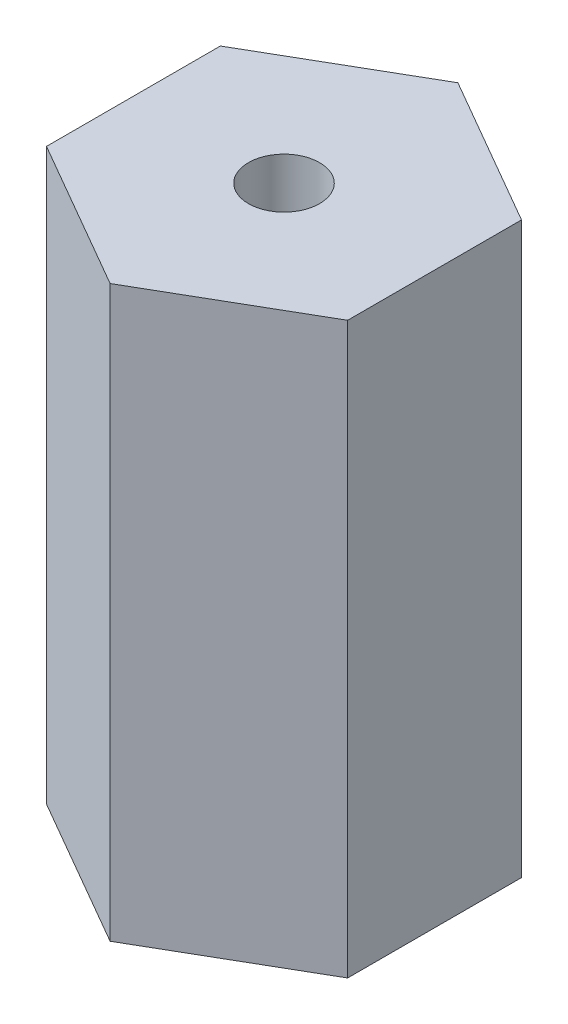
ISO-10303-21;
HEADER;
FILE_DESCRIPTION(('STEP AP214'),'2;1');
FILE_NAME('part.step','',(''),(''),'','','');
FILE_SCHEMA(('AUTOMOTIVE_DESIGN { 1 0 10303 214 1 1 1 1 }'));
ENDSEC;
DATA;
#1=APPLICATION_CONTEXT('core data for automotive mechanical design processes');
#2=APPLICATION_PROTOCOL_DEFINITION('international standard','automotive_design',2000,#1);
#3=PRODUCT_CONTEXT('',#1,'mechanical');
#4=PRODUCT('Part','Part','',(#3));
#5=PRODUCT_RELATED_PRODUCT_CATEGORY('part','',(#4));
#6=PRODUCT_DEFINITION_FORMATION('','',#4);
#7=PRODUCT_DEFINITION_CONTEXT('part definition',#1,'design');
#8=PRODUCT_DEFINITION('design','',#6,#7);
#9=PRODUCT_DEFINITION_SHAPE('','',#8);
#10=(LENGTH_UNIT() NAMED_UNIT(*) SI_UNIT(.MILLI.,.METRE.));
#11=(NAMED_UNIT(*) PLANE_ANGLE_UNIT() SI_UNIT($,.RADIAN.));
#12=(NAMED_UNIT(*) SI_UNIT($,.STERADIAN.) SOLID_ANGLE_UNIT());
#13=UNCERTAINTY_MEASURE_WITH_UNIT(LENGTH_MEASURE(1.E-05),#10,'distance_accuracy_value','');
#14=(GEOMETRIC_REPRESENTATION_CONTEXT(3) GLOBAL_UNCERTAINTY_ASSIGNED_CONTEXT((#13)) GLOBAL_UNIT_ASSIGNED_CONTEXT((#10,
#11,#12)) REPRESENTATION_CONTEXT('',''));
#15=CARTESIAN_POINT('',(0.,0.,0.));
#16=DIRECTION('',(0.,0.,1.));
#17=DIRECTION('',(1.,0.,0.));
#18=AXIS2_PLACEMENT_3D('',#15,#16,#17);
#19=CARTESIAN_POINT('',(0.,24.0204498,0.));
#20=DIRECTION('',(0.,1.,0.));
#21=DIRECTION('',(0.,0.,1.));
#22=AXIS2_PLACEMENT_3D('',#19,#20,#21);
#23=PLANE('',#22);
#24=DIRECTION('',(-0.866025403784442,0.,-0.499999999999995));
#25=VECTOR('',#24,1.);
#26=CARTESIAN_POINT('',(6.34999999999996,24.0204498,-3.6661742093542));
#27=LINE('',#26,#25);
#28=CARTESIAN_POINT('',(6.34999999999996,24.0204498,-3.6661742093542));
#29=VERTEX_POINT('',#28);
#30=CARTESIAN_POINT('',(0.,24.0204498,-7.33234841870825));
#31=VERTEX_POINT('',#30);
#32=EDGE_CURVE('E136',#29,#31,#27,.T.);
#33=ORIENTED_EDGE('',*,*,#32,.T.);
#34=DIRECTION('',(-0.866025403784438,0.,0.500000000000001));
#35=VECTOR('',#34,1.);
#36=CARTESIAN_POINT('',(0.,24.0204498,-7.33234841870825));
#37=LINE('',#36,#35);
#38=CARTESIAN_POINT('',(-6.35000000000001,24.0204498,-3.66617420935411));
#39=VERTEX_POINT('',#38);
#40=EDGE_CURVE('E94',#31,#39,#37,.T.);
#41=ORIENTED_EDGE('',*,*,#40,.T.);
#42=DIRECTION('',(0.,0.,1.));
#43=VECTOR('',#42,1.);
#44=CARTESIAN_POINT('',(-6.35000000000001,24.0204498,-3.66617420935411));
#45=LINE('',#44,#43);
#46=CARTESIAN_POINT('',(-6.34999999999999,24.0204498,3.66617420935416));
#47=VERTEX_POINT('',#46);
#48=EDGE_CURVE('E107',#39,#47,#45,.T.);
#49=ORIENTED_EDGE('',*,*,#48,.T.);
#50=DIRECTION('',(0.866025403784442,0.,0.499999999999995));
#51=VECTOR('',#50,1.);
#52=CARTESIAN_POINT('',(-6.34999999999999,24.0204498,3.66617420935416));
#53=LINE('',#52,#51);
#54=CARTESIAN_POINT('',(0.,24.0204498,7.33234841870825));
#55=VERTEX_POINT('',#54);
#56=EDGE_CURVE('E101',#47,#55,#53,.T.);
#57=ORIENTED_EDGE('',*,*,#56,.T.);
#58=DIRECTION('',(0.866025403784435,0.,-0.500000000000007));
#59=VECTOR('',#58,1.);
#60=CARTESIAN_POINT('',(0.,24.0204498,7.33234841870825));
#61=LINE('',#60,#59);
#62=CARTESIAN_POINT('',(6.35000000000004,24.0204498,3.66617420935407));
#63=VERTEX_POINT('',#62);
#64=EDGE_CURVE('E105',#55,#63,#61,.T.);
#65=ORIENTED_EDGE('',*,*,#64,.T.);
#66=DIRECTION('',(0.,0.,-1.));
#67=VECTOR('',#66,1.);
#68=CARTESIAN_POINT('',(6.35000000000004,24.0204498,3.66617420935407));
#69=LINE('',#68,#67);
#70=EDGE_CURVE('E57',#63,#29,#69,.T.);
#71=ORIENTED_EDGE('',*,*,#70,.T.);
#72=EDGE_LOOP('',(#33,#41,#49,#57,#65,#71));
#73=FACE_BOUND('',#72,.T.);
#74=CARTESIAN_POINT('',(0.,24.0204498,0.));
#75=DIRECTION('',(0.,1.,0.));
#76=DIRECTION('',(0.,0.,1.));
#77=AXIS2_PLACEMENT_3D('',#74,#75,#76);
#78=CIRCLE('',#77,1.5);
#79=CARTESIAN_POINT('',(0.,24.0204498,1.5));
#80=VERTEX_POINT('',#79);
#81=EDGE_CURVE('E129',#80,#80,#78,.T.);
#82=ORIENTED_EDGE('',*,*,#81,.F.);
#83=EDGE_LOOP('',(#82));
#84=FACE_BOUND('',#83,.T.);
#85=ADVANCED_FACE('F39',(#73,#84),#23,.T.);
#86=CARTESIAN_POINT('',(0.,0.,0.));
#87=DIRECTION('',(0.,1.,0.));
#88=DIRECTION('',(0.,0.,1.));
#89=AXIS2_PLACEMENT_3D('',#86,#87,#88);
#90=PLANE('',#89);
#91=CARTESIAN_POINT('',(0.,0.,0.));
#92=DIRECTION('',(0.,1.,0.));
#93=DIRECTION('',(0.,0.,1.));
#94=AXIS2_PLACEMENT_3D('',#91,#92,#93);
#95=CIRCLE('',#94,5.);
#96=CARTESIAN_POINT('',(0.,0.,5.));
#97=VERTEX_POINT('',#96);
#98=EDGE_CURVE('E185',#97,#97,#95,.T.);
#99=ORIENTED_EDGE('',*,*,#98,.T.);
#100=EDGE_LOOP('',(#99));
#101=FACE_BOUND('',#100,.T.);
#102=DIRECTION('',(-0.866025403784442,0.,-0.499999999999995));
#103=VECTOR('',#102,1.);
#104=CARTESIAN_POINT('',(6.34999999999996,0.,-3.6661742093542));
#105=LINE('',#104,#103);
#106=CARTESIAN_POINT('',(6.34999999999996,0.,-3.6661742093542));
#107=VERTEX_POINT('',#106);
#108=CARTESIAN_POINT('',(0.,0.,-7.33234841870825));
#109=VERTEX_POINT('',#108);
#110=EDGE_CURVE('E125',#107,#109,#105,.T.);
#111=ORIENTED_EDGE('',*,*,#110,.F.);
#112=DIRECTION('',(0.,0.,-1.));
#113=VECTOR('',#112,1.);
#114=CARTESIAN_POINT('',(6.35000000000004,0.,3.66617420935407));
#115=LINE('',#114,#113);
#116=CARTESIAN_POINT('',(6.35000000000004,0.,3.66617420935407));
#117=VERTEX_POINT('',#116);
#118=EDGE_CURVE('E86',#117,#107,#115,.T.);
#119=ORIENTED_EDGE('',*,*,#118,.F.);
#120=DIRECTION('',(0.866025403784435,0.,-0.500000000000007));
#121=VECTOR('',#120,1.);
#122=CARTESIAN_POINT('',(0.,0.,7.33234841870825));
#123=LINE('',#122,#121);
#124=CARTESIAN_POINT('',(0.,0.,7.33234841870825));
#125=VERTEX_POINT('',#124);
#126=EDGE_CURVE('E80',#125,#117,#123,.T.);
#127=ORIENTED_EDGE('',*,*,#126,.F.);
#128=DIRECTION('',(0.866025403784442,0.,0.499999999999995));
#129=VECTOR('',#128,1.);
#130=CARTESIAN_POINT('',(-6.34999999999999,0.,3.66617420935416));
#131=LINE('',#130,#129);
#132=CARTESIAN_POINT('',(-6.34999999999999,0.,3.66617420935416));
#133=VERTEX_POINT('',#132);
#134=EDGE_CURVE('E115',#133,#125,#131,.T.);
#135=ORIENTED_EDGE('',*,*,#134,.F.);
#136=DIRECTION('',(0.,0.,1.));
#137=VECTOR('',#136,1.);
#138=CARTESIAN_POINT('',(-6.35000000000001,0.,-3.66617420935411));
#139=LINE('',#138,#137);
#140=CARTESIAN_POINT('',(-6.35000000000001,0.,-3.66617420935411));
#141=VERTEX_POINT('',#140);
#142=EDGE_CURVE('E131',#141,#133,#139,.T.);
#143=ORIENTED_EDGE('',*,*,#142,.F.);
#144=DIRECTION('',(-0.866025403784438,0.,0.500000000000001));
#145=VECTOR('',#144,1.);
#146=CARTESIAN_POINT('',(0.,0.,-7.33234841870825));
#147=LINE('',#146,#145);
#148=EDGE_CURVE('E128',#109,#141,#147,.T.);
#149=ORIENTED_EDGE('',*,*,#148,.F.);
#150=EDGE_LOOP('',(#111,#119,#127,#135,#143,#149));
#151=FACE_BOUND('',#150,.T.);
#152=ADVANCED_FACE('F146',(#101,#151),#90,.F.);
#153=CARTESIAN_POINT('',(6.34999999999996,24.0204498,-3.6661742093542));
#154=DIRECTION('',(-0.499999999999995,0.,0.866025403784441));
#155=DIRECTION('',(0.866025403784442,0.,0.499999999999995));
#156=AXIS2_PLACEMENT_3D('',#153,#154,#155);
#157=PLANE('',#156);
#158=ORIENTED_EDGE('',*,*,#110,.T.);
#159=DIRECTION('',(0.,-1.,0.));
#160=VECTOR('',#159,1.);
#161=CARTESIAN_POINT('',(0.,24.0204498,-7.33234841870825));
#162=LINE('',#161,#160);
#163=EDGE_CURVE('E11',#31,#109,#162,.T.);
#164=ORIENTED_EDGE('',*,*,#163,.F.);
#165=ORIENTED_EDGE('',*,*,#32,.F.);
#166=DIRECTION('',(0.,-1.,0.));
#167=VECTOR('',#166,1.);
#168=CARTESIAN_POINT('',(6.34999999999996,24.0204498,-3.6661742093542));
#169=LINE('',#168,#167);
#170=EDGE_CURVE('E121',#29,#107,#169,.T.);
#171=ORIENTED_EDGE('',*,*,#170,.T.);
#172=EDGE_LOOP('',(#158,#164,#165,#171));
#173=FACE_BOUND('',#172,.T.);
#174=ADVANCED_FACE('F41',(#173),#157,.F.);
#175=CARTESIAN_POINT('',(0.,24.0204498,-7.33234841870825));
#176=DIRECTION('',(0.500000000000001,0.,0.866025403784438));
#177=DIRECTION('',(0.866025403784438,0.,-0.500000000000001));
#178=AXIS2_PLACEMENT_3D('',#175,#176,#177);
#179=PLANE('',#178);
#180=ORIENTED_EDGE('',*,*,#148,.T.);
#181=DIRECTION('',(0.,-1.,0.));
#182=VECTOR('',#181,1.);
#183=CARTESIAN_POINT('',(-6.35000000000001,24.0204498,-3.66617420935411));
#184=LINE('',#183,#182);
#185=EDGE_CURVE('E49',#39,#141,#184,.T.);
#186=ORIENTED_EDGE('',*,*,#185,.F.);
#187=ORIENTED_EDGE('',*,*,#40,.F.);
#188=ORIENTED_EDGE('',*,*,#163,.T.);
#189=EDGE_LOOP('',(#180,#186,#187,#188));
#190=FACE_BOUND('',#189,.T.);
#191=ADVANCED_FACE('F217',(#190),#179,.F.);
#192=CARTESIAN_POINT('',(-6.35000000000001,24.0204498,-3.66617420935411));
#193=DIRECTION('',(1.,0.,0.));
#194=DIRECTION('',(0.,0.,-1.));
#195=AXIS2_PLACEMENT_3D('',#192,#193,#194);
#196=PLANE('',#195);
#197=ORIENTED_EDGE('',*,*,#142,.T.);
#198=DIRECTION('',(0.,-1.,0.));
#199=VECTOR('',#198,1.);
#200=CARTESIAN_POINT('',(-6.34999999999999,24.0204498,3.66617420935416));
#201=LINE('',#200,#199);
#202=EDGE_CURVE('E116',#47,#133,#201,.T.);
#203=ORIENTED_EDGE('',*,*,#202,.F.);
#204=ORIENTED_EDGE('',*,*,#48,.F.);
#205=ORIENTED_EDGE('',*,*,#185,.T.);
#206=EDGE_LOOP('',(#197,#203,#204,#205));
#207=FACE_BOUND('',#206,.T.);
#208=ADVANCED_FACE('F143',(#207),#196,.F.);
#209=CARTESIAN_POINT('',(-6.34999999999999,24.0204498,3.66617420935416));
#210=DIRECTION('',(0.499999999999995,0.,-0.866025403784441));
#211=DIRECTION('',(-0.866025403784442,0.,-0.499999999999995));
#212=AXIS2_PLACEMENT_3D('',#209,#210,#211);
#213=PLANE('',#212);
#214=ORIENTED_EDGE('',*,*,#134,.T.);
#215=DIRECTION('',(0.,-1.,0.));
#216=VECTOR('',#215,1.);
#217=CARTESIAN_POINT('',(0.,24.0204498,7.33234841870825));
#218=LINE('',#217,#216);
#219=EDGE_CURVE('E112',#55,#125,#218,.T.);
#220=ORIENTED_EDGE('',*,*,#219,.F.);
#221=ORIENTED_EDGE('',*,*,#56,.F.);
#222=ORIENTED_EDGE('',*,*,#202,.T.);
#223=EDGE_LOOP('',(#214,#220,#221,#222));
#224=FACE_BOUND('',#223,.T.);
#225=ADVANCED_FACE('F113',(#224),#213,.F.);
#226=CARTESIAN_POINT('',(0.,24.0204498,7.33234841870825));
#227=DIRECTION('',(-0.500000000000007,0.,-0.866025403784434));
#228=DIRECTION('',(-0.866025403784435,0.,0.500000000000007));
#229=AXIS2_PLACEMENT_3D('',#226,#227,#228);
#230=PLANE('',#229);
#231=ORIENTED_EDGE('',*,*,#126,.T.);
#232=DIRECTION('',(0.,-1.,0.));
#233=VECTOR('',#232,1.);
#234=CARTESIAN_POINT('',(6.35000000000004,24.0204498,3.66617420935407));
#235=LINE('',#234,#233);
#236=EDGE_CURVE('E117',#63,#117,#235,.T.);
#237=ORIENTED_EDGE('',*,*,#236,.F.);
#238=ORIENTED_EDGE('',*,*,#64,.F.);
#239=ORIENTED_EDGE('',*,*,#219,.T.);
#240=EDGE_LOOP('',(#231,#237,#238,#239));
#241=FACE_BOUND('',#240,.T.);
#242=ADVANCED_FACE('F119',(#241),#230,.F.);
#243=CARTESIAN_POINT('',(6.35000000000004,24.0204498,3.66617420935407));
#244=DIRECTION('',(-1.,0.,0.));
#245=DIRECTION('',(0.,0.,1.));
#246=AXIS2_PLACEMENT_3D('',#243,#244,#245);
#247=PLANE('',#246);
#248=ORIENTED_EDGE('',*,*,#118,.T.);
#249=ORIENTED_EDGE('',*,*,#170,.F.);
#250=ORIENTED_EDGE('',*,*,#70,.F.);
#251=ORIENTED_EDGE('',*,*,#236,.T.);
#252=EDGE_LOOP('',(#248,#249,#250,#251));
#253=FACE_BOUND('',#252,.T.);
#254=ADVANCED_FACE('F150',(#253),#247,.F.);
#255=CARTESIAN_POINT('',(0.,24.0204498,0.));
#256=DIRECTION('',(0.,-1.,0.));
#257=DIRECTION('',(0.,0.,-1.));
#258=AXIS2_PLACEMENT_3D('',#255,#256,#257);
#259=CYLINDRICAL_SURFACE('',#258,1.5);
#260=CARTESIAN_POINT('',(0.,2.54,0.));
#261=DIRECTION('',(0.,1.,0.));
#262=DIRECTION('',(0.,0.,1.));
#263=AXIS2_PLACEMENT_3D('',#260,#261,#262);
#264=CIRCLE('',#263,1.5);
#265=CARTESIAN_POINT('',(0.,2.54,1.5));
#266=VERTEX_POINT('',#265);
#267=EDGE_CURVE('E43',#266,#266,#264,.T.);
#268=ORIENTED_EDGE('',*,*,#267,.F.);
#269=EDGE_LOOP('',(#268));
#270=FACE_BOUND('',#269,.T.);
#271=ORIENTED_EDGE('',*,*,#81,.T.);
#272=EDGE_LOOP('',(#271));
#273=FACE_BOUND('',#272,.T.);
#274=ADVANCED_FACE('F152',(#270,#273),#259,.F.);
#275=CARTESIAN_POINT('',(0.,2.54,0.));
#276=DIRECTION('',(0.,-1.,0.));
#277=DIRECTION('',(0.,0.,-1.));
#278=AXIS2_PLACEMENT_3D('',#275,#276,#277);
#279=CYLINDRICAL_SURFACE('',#278,5.);
#280=CARTESIAN_POINT('',(0.,2.54,0.));
#281=DIRECTION('',(0.,1.,0.));
#282=DIRECTION('',(0.,0.,1.));
#283=AXIS2_PLACEMENT_3D('',#280,#281,#282);
#284=CIRCLE('',#283,5.);
#285=CARTESIAN_POINT('',(0.,2.54,5.));
#286=VERTEX_POINT('',#285);
#287=EDGE_CURVE('E184',#286,#286,#284,.T.);
#288=ORIENTED_EDGE('',*,*,#287,.T.);
#289=EDGE_LOOP('',(#288));
#290=FACE_BOUND('',#289,.T.);
#291=ORIENTED_EDGE('',*,*,#98,.F.);
#292=EDGE_LOOP('',(#291));
#293=FACE_BOUND('',#292,.T.);
#294=ADVANCED_FACE('F159',(#290,#293),#279,.F.);
#295=CARTESIAN_POINT('',(0.,2.54,0.));
#296=DIRECTION('',(0.,1.,0.));
#297=DIRECTION('',(0.,0.,1.));
#298=AXIS2_PLACEMENT_3D('',#295,#296,#297);
#299=PLANE('',#298);
#300=ORIENTED_EDGE('',*,*,#267,.T.);
#301=EDGE_LOOP('',(#300));
#302=FACE_BOUND('',#301,.T.);
#303=ORIENTED_EDGE('',*,*,#287,.F.);
#304=EDGE_LOOP('',(#303));
#305=FACE_BOUND('',#304,.T.);
#306=ADVANCED_FACE('F173',(#302,#305),#299,.F.);
#307=CLOSED_SHELL('',(#85,#152,#174,#191,#208,#225,#242,#254,#274,#294,#306));
#308=MANIFOLD_SOLID_BREP('B2',#307);
#309=ADVANCED_BREP_SHAPE_REPRESENTATION('',(#18,#308),#14);
#310=SHAPE_DEFINITION_REPRESENTATION(#9,#309);
ENDSEC;
END-ISO-10303-21;
